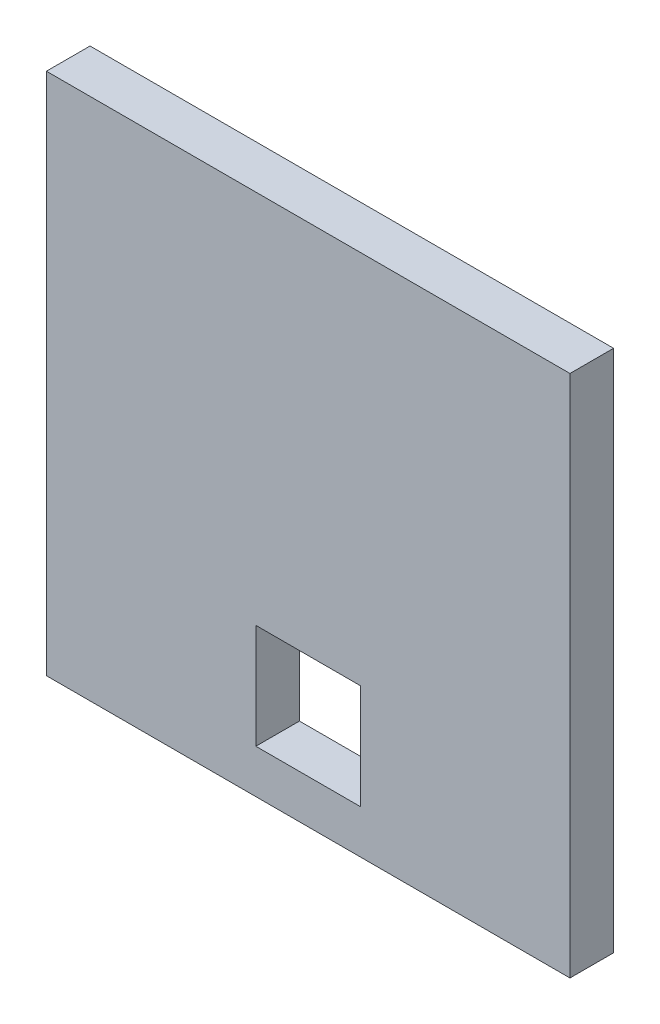
ISO-10303-21;
HEADER;
FILE_DESCRIPTION(('STEP AP214'),'2;1');
FILE_NAME('part.step','',(''),(''),'','','');
FILE_SCHEMA(('AUTOMOTIVE_DESIGN { 1 0 10303 214 1 1 1 1 }'));
ENDSEC;
DATA;
#1=APPLICATION_CONTEXT('core data for automotive mechanical design processes');
#2=APPLICATION_PROTOCOL_DEFINITION('international standard','automotive_design',2000,#1);
#3=PRODUCT_CONTEXT('',#1,'mechanical');
#4=PRODUCT('Part','Part','',(#3));
#5=PRODUCT_RELATED_PRODUCT_CATEGORY('part','',(#4));
#6=PRODUCT_DEFINITION_FORMATION('','',#4);
#7=PRODUCT_DEFINITION_CONTEXT('part definition',#1,'design');
#8=PRODUCT_DEFINITION('design','',#6,#7);
#9=PRODUCT_DEFINITION_SHAPE('','',#8);
#10=(LENGTH_UNIT() NAMED_UNIT(*) SI_UNIT(.MILLI.,.METRE.));
#11=(NAMED_UNIT(*) PLANE_ANGLE_UNIT() SI_UNIT($,.RADIAN.));
#12=(NAMED_UNIT(*) SI_UNIT($,.STERADIAN.) SOLID_ANGLE_UNIT());
#13=UNCERTAINTY_MEASURE_WITH_UNIT(LENGTH_MEASURE(1.E-05),#10,'distance_accuracy_value','');
#14=(GEOMETRIC_REPRESENTATION_CONTEXT(3) GLOBAL_UNCERTAINTY_ASSIGNED_CONTEXT((#13)) GLOBAL_UNIT_ASSIGNED_CONTEXT((#10,
#11,#12)) REPRESENTATION_CONTEXT('',''));
#15=CARTESIAN_POINT('',(0.,0.,0.));
#16=DIRECTION('',(0.,0.,1.));
#17=DIRECTION('',(1.,0.,0.));
#18=AXIS2_PLACEMENT_3D('',#15,#16,#17);
#19=CARTESIAN_POINT('',(0.,0.,3.175));
#20=DIRECTION('',(1.,0.,0.));
#21=DIRECTION('',(0.,0.,-1.));
#22=AXIS2_PLACEMENT_3D('',#19,#20,#21);
#23=PLANE('',#22);
#24=DIRECTION('',(0.,-1.,0.));
#25=VECTOR('',#24,1.);
#26=CARTESIAN_POINT('',(0.,0.,0.));
#27=LINE('',#26,#25);
#28=CARTESIAN_POINT('',(0.,38.1,0.));
#29=VERTEX_POINT('',#28);
#30=CARTESIAN_POINT('',(0.,0.,0.));
#31=VERTEX_POINT('',#30);
#32=EDGE_CURVE('E136',#29,#31,#27,.T.);
#33=ORIENTED_EDGE('',*,*,#32,.T.);
#34=DIRECTION('',(0.,0.,-1.));
#35=VECTOR('',#34,1.);
#36=CARTESIAN_POINT('',(0.,0.,3.175));
#37=LINE('',#36,#35);
#38=CARTESIAN_POINT('',(0.,0.,3.175));
#39=VERTEX_POINT('',#38);
#40=EDGE_CURVE('E11',#39,#31,#37,.T.);
#41=ORIENTED_EDGE('',*,*,#40,.F.);
#42=DIRECTION('',(0.,-1.,0.));
#43=VECTOR('',#42,1.);
#44=CARTESIAN_POINT('',(0.,0.,3.175));
#45=LINE('',#44,#43);
#46=CARTESIAN_POINT('',(0.,38.1,3.175));
#47=VERTEX_POINT('',#46);
#48=EDGE_CURVE('E140',#47,#39,#45,.T.);
#49=ORIENTED_EDGE('',*,*,#48,.F.);
#50=DIRECTION('',(0.,0.,-1.));
#51=VECTOR('',#50,1.);
#52=CARTESIAN_POINT('',(0.,38.1,3.175));
#53=LINE('',#52,#51);
#54=EDGE_CURVE('E150',#47,#29,#53,.T.);
#55=ORIENTED_EDGE('',*,*,#54,.T.);
#56=EDGE_LOOP('',(#33,#41,#49,#55));
#57=FACE_BOUND('',#56,.T.);
#58=ADVANCED_FACE('F39',(#57),#23,.F.);
#59=CARTESIAN_POINT('',(0.,0.,3.175));
#60=DIRECTION('',(0.,1.,0.));
#61=DIRECTION('',(0.,0.,1.));
#62=AXIS2_PLACEMENT_3D('',#59,#60,#61);
#63=PLANE('',#62);
#64=DIRECTION('',(1.,0.,0.));
#65=VECTOR('',#64,1.);
#66=CARTESIAN_POINT('',(0.,0.,0.));
#67=LINE('',#66,#65);
#68=CARTESIAN_POINT('',(38.1,0.,0.));
#69=VERTEX_POINT('',#68);
#70=EDGE_CURVE('E153',#31,#69,#67,.T.);
#71=ORIENTED_EDGE('',*,*,#70,.T.);
#72=DIRECTION('',(0.,0.,-1.));
#73=VECTOR('',#72,1.);
#74=CARTESIAN_POINT('',(38.1,0.,3.175));
#75=LINE('',#74,#73);
#76=CARTESIAN_POINT('',(38.1,0.,3.175));
#77=VERTEX_POINT('',#76);
#78=EDGE_CURVE('E46',#77,#69,#75,.T.);
#79=ORIENTED_EDGE('',*,*,#78,.F.);
#80=DIRECTION('',(1.,0.,0.));
#81=VECTOR('',#80,1.);
#82=CARTESIAN_POINT('',(0.,0.,3.175));
#83=LINE('',#82,#81);
#84=EDGE_CURVE('E143',#39,#77,#83,.T.);
#85=ORIENTED_EDGE('',*,*,#84,.F.);
#86=ORIENTED_EDGE('',*,*,#40,.T.);
#87=EDGE_LOOP('',(#71,#79,#85,#86));
#88=FACE_BOUND('',#87,.T.);
#89=ADVANCED_FACE('F181',(#88),#63,.F.);
#90=CARTESIAN_POINT('',(38.1,0.,3.175));
#91=DIRECTION('',(-1.,0.,0.));
#92=DIRECTION('',(0.,0.,1.));
#93=AXIS2_PLACEMENT_3D('',#90,#91,#92);
#94=PLANE('',#93);
#95=DIRECTION('',(0.,1.,0.));
#96=VECTOR('',#95,1.);
#97=CARTESIAN_POINT('',(38.1,0.,0.));
#98=LINE('',#97,#96);
#99=CARTESIAN_POINT('',(38.1,38.1,0.));
#100=VERTEX_POINT('',#99);
#101=EDGE_CURVE('E155',#69,#100,#98,.T.);
#102=ORIENTED_EDGE('',*,*,#101,.T.);
#103=DIRECTION('',(0.,0.,-1.));
#104=VECTOR('',#103,1.);
#105=CARTESIAN_POINT('',(38.1,38.1,3.175));
#106=LINE('',#105,#104);
#107=CARTESIAN_POINT('',(38.1,38.1,3.175));
#108=VERTEX_POINT('',#107);
#109=EDGE_CURVE('E160',#108,#100,#106,.T.);
#110=ORIENTED_EDGE('',*,*,#109,.F.);
#111=DIRECTION('',(0.,1.,0.));
#112=VECTOR('',#111,1.);
#113=CARTESIAN_POINT('',(38.1,0.,3.175));
#114=LINE('',#113,#112);
#115=EDGE_CURVE('E146',#77,#108,#114,.T.);
#116=ORIENTED_EDGE('',*,*,#115,.F.);
#117=ORIENTED_EDGE('',*,*,#78,.T.);
#118=EDGE_LOOP('',(#102,#110,#116,#117));
#119=FACE_BOUND('',#118,.T.);
#120=ADVANCED_FACE('F167',(#119),#94,.F.);
#121=CARTESIAN_POINT('',(0.,38.1,3.175));
#122=DIRECTION('',(0.,-1.,0.));
#123=DIRECTION('',(0.,0.,-1.));
#124=AXIS2_PLACEMENT_3D('',#121,#122,#123);
#125=PLANE('',#124);
#126=DIRECTION('',(-1.,0.,0.));
#127=VECTOR('',#126,1.);
#128=CARTESIAN_POINT('',(0.,38.1,0.));
#129=LINE('',#128,#127);
#130=EDGE_CURVE('E144',#100,#29,#129,.T.);
#131=ORIENTED_EDGE('',*,*,#130,.T.);
#132=ORIENTED_EDGE('',*,*,#54,.F.);
#133=DIRECTION('',(-1.,0.,0.));
#134=VECTOR('',#133,1.);
#135=CARTESIAN_POINT('',(0.,38.1,3.175));
#136=LINE('',#135,#134);
#137=EDGE_CURVE('E148',#108,#47,#136,.T.);
#138=ORIENTED_EDGE('',*,*,#137,.F.);
#139=ORIENTED_EDGE('',*,*,#109,.T.);
#140=EDGE_LOOP('',(#131,#132,#138,#139));
#141=FACE_BOUND('',#140,.T.);
#142=ADVANCED_FACE('F174',(#141),#125,.F.);
#143=CARTESIAN_POINT('',(0.,0.,3.175));
#144=DIRECTION('',(0.,0.,-1.));
#145=DIRECTION('',(-1.,0.,0.));
#146=AXIS2_PLACEMENT_3D('',#143,#144,#145);
#147=PLANE('',#146);
#148=DIRECTION('',(1.,0.,0.));
#149=VECTOR('',#148,1.);
#150=CARTESIAN_POINT('',(15.24,3.175,3.175));
#151=LINE('',#150,#149);
#152=CARTESIAN_POINT('',(15.24,3.175,3.175));
#153=VERTEX_POINT('',#152);
#154=CARTESIAN_POINT('',(22.86,3.175,3.175));
#155=VERTEX_POINT('',#154);
#156=EDGE_CURVE('E130',#153,#155,#151,.T.);
#157=ORIENTED_EDGE('',*,*,#156,.F.);
#158=DIRECTION('',(0.,-1.,0.));
#159=VECTOR('',#158,1.);
#160=CARTESIAN_POINT('',(15.24,10.795,3.175));
#161=LINE('',#160,#159);
#162=CARTESIAN_POINT('',(15.24,10.795,3.175));
#163=VERTEX_POINT('',#162);
#164=EDGE_CURVE('E53',#163,#153,#161,.T.);
#165=ORIENTED_EDGE('',*,*,#164,.F.);
#166=DIRECTION('',(-1.,0.,0.));
#167=VECTOR('',#166,1.);
#168=CARTESIAN_POINT('',(15.24,10.795,3.175));
#169=LINE('',#168,#167);
#170=CARTESIAN_POINT('',(22.86,10.795,3.175));
#171=VERTEX_POINT('',#170);
#172=EDGE_CURVE('E121',#171,#163,#169,.T.);
#173=ORIENTED_EDGE('',*,*,#172,.F.);
#174=DIRECTION('',(0.,1.,0.));
#175=VECTOR('',#174,1.);
#176=CARTESIAN_POINT('',(22.86,10.795,3.175));
#177=LINE('',#176,#175);
#178=EDGE_CURVE('E124',#155,#171,#177,.T.);
#179=ORIENTED_EDGE('',*,*,#178,.F.);
#180=EDGE_LOOP('',(#157,#165,#173,#179));
#181=FACE_BOUND('',#180,.T.);
#182=ORIENTED_EDGE('',*,*,#48,.T.);
#183=ORIENTED_EDGE('',*,*,#84,.T.);
#184=ORIENTED_EDGE('',*,*,#115,.T.);
#185=ORIENTED_EDGE('',*,*,#137,.T.);
#186=EDGE_LOOP('',(#182,#183,#184,#185));
#187=FACE_BOUND('',#186,.T.);
#188=ADVANCED_FACE('F180',(#181,#187),#147,.F.);
#189=CARTESIAN_POINT('',(0.,0.,0.));
#190=DIRECTION('',(0.,0.,-1.));
#191=DIRECTION('',(-1.,0.,0.));
#192=AXIS2_PLACEMENT_3D('',#189,#190,#191);
#193=PLANE('',#192);
#194=DIRECTION('',(0.,-1.,0.));
#195=VECTOR('',#194,1.);
#196=CARTESIAN_POINT('',(15.24,10.795,0.));
#197=LINE('',#196,#195);
#198=CARTESIAN_POINT('',(15.24,10.795,0.));
#199=VERTEX_POINT('',#198);
#200=CARTESIAN_POINT('',(15.24,3.175,0.));
#201=VERTEX_POINT('',#200);
#202=EDGE_CURVE('E105',#199,#201,#197,.T.);
#203=ORIENTED_EDGE('',*,*,#202,.T.);
#204=DIRECTION('',(1.,0.,0.));
#205=VECTOR('',#204,1.);
#206=CARTESIAN_POINT('',(15.24,3.175,0.));
#207=LINE('',#206,#205);
#208=CARTESIAN_POINT('',(22.86,3.175,0.));
#209=VERTEX_POINT('',#208);
#210=EDGE_CURVE('E114',#201,#209,#207,.T.);
#211=ORIENTED_EDGE('',*,*,#210,.T.);
#212=DIRECTION('',(0.,1.,0.));
#213=VECTOR('',#212,1.);
#214=CARTESIAN_POINT('',(22.86,10.795,0.));
#215=LINE('',#214,#213);
#216=CARTESIAN_POINT('',(22.86,10.795,0.));
#217=VERTEX_POINT('',#216);
#218=EDGE_CURVE('E61',#209,#217,#215,.T.);
#219=ORIENTED_EDGE('',*,*,#218,.T.);
#220=DIRECTION('',(-1.,0.,0.));
#221=VECTOR('',#220,1.);
#222=CARTESIAN_POINT('',(15.24,10.795,0.));
#223=LINE('',#222,#221);
#224=EDGE_CURVE('E111',#217,#199,#223,.T.);
#225=ORIENTED_EDGE('',*,*,#224,.T.);
#226=EDGE_LOOP('',(#203,#211,#219,#225));
#227=FACE_BOUND('',#226,.T.);
#228=ORIENTED_EDGE('',*,*,#32,.F.);
#229=ORIENTED_EDGE('',*,*,#130,.F.);
#230=ORIENTED_EDGE('',*,*,#101,.F.);
#231=ORIENTED_EDGE('',*,*,#70,.F.);
#232=EDGE_LOOP('',(#228,#229,#230,#231));
#233=FACE_BOUND('',#232,.T.);
#234=ADVANCED_FACE('F118',(#227,#233),#193,.T.);
#235=CARTESIAN_POINT('',(15.24,10.795,0.));
#236=DIRECTION('',(-1.,0.,0.));
#237=DIRECTION('',(0.,-1.,0.));
#238=AXIS2_PLACEMENT_3D('',#235,#236,#237);
#239=PLANE('',#238);
#240=ORIENTED_EDGE('',*,*,#164,.T.);
#241=DIRECTION('',(0.,0.,1.));
#242=VECTOR('',#241,1.);
#243=CARTESIAN_POINT('',(15.24,3.175,0.));
#244=LINE('',#243,#242);
#245=EDGE_CURVE('E101',#201,#153,#244,.T.);
#246=ORIENTED_EDGE('',*,*,#245,.F.);
#247=ORIENTED_EDGE('',*,*,#202,.F.);
#248=DIRECTION('',(0.,0.,1.));
#249=VECTOR('',#248,1.);
#250=CARTESIAN_POINT('',(15.24,10.795,0.));
#251=LINE('',#250,#249);
#252=EDGE_CURVE('E134',#199,#163,#251,.T.);
#253=ORIENTED_EDGE('',*,*,#252,.T.);
#254=EDGE_LOOP('',(#240,#246,#247,#253));
#255=FACE_BOUND('',#254,.T.);
#256=ADVANCED_FACE('F103',(#255),#239,.F.);
#257=CARTESIAN_POINT('',(15.24,10.795,0.));
#258=DIRECTION('',(0.,1.,0.));
#259=DIRECTION('',(0.,0.,1.));
#260=AXIS2_PLACEMENT_3D('',#257,#258,#259);
#261=PLANE('',#260);
#262=ORIENTED_EDGE('',*,*,#172,.T.);
#263=ORIENTED_EDGE('',*,*,#252,.F.);
#264=ORIENTED_EDGE('',*,*,#224,.F.);
#265=DIRECTION('',(0.,0.,1.));
#266=VECTOR('',#265,1.);
#267=CARTESIAN_POINT('',(22.86,10.795,0.));
#268=LINE('',#267,#266);
#269=EDGE_CURVE('E137',#217,#171,#268,.T.);
#270=ORIENTED_EDGE('',*,*,#269,.T.);
#271=EDGE_LOOP('',(#262,#263,#264,#270));
#272=FACE_BOUND('',#271,.T.);
#273=ADVANCED_FACE('F198',(#272),#261,.F.);
#274=CARTESIAN_POINT('',(22.86,10.795,0.));
#275=DIRECTION('',(1.,0.,0.));
#276=DIRECTION('',(0.,0.,-1.));
#277=AXIS2_PLACEMENT_3D('',#274,#275,#276);
#278=PLANE('',#277);
#279=ORIENTED_EDGE('',*,*,#178,.T.);
#280=ORIENTED_EDGE('',*,*,#269,.F.);
#281=ORIENTED_EDGE('',*,*,#218,.F.);
#282=DIRECTION('',(0.,0.,1.));
#283=VECTOR('',#282,1.);
#284=CARTESIAN_POINT('',(22.86,3.175,0.));
#285=LINE('',#284,#283);
#286=EDGE_CURVE('E110',#209,#155,#285,.T.);
#287=ORIENTED_EDGE('',*,*,#286,.T.);
#288=EDGE_LOOP('',(#279,#280,#281,#287));
#289=FACE_BOUND('',#288,.T.);
#290=ADVANCED_FACE('F201',(#289),#278,.F.);
#291=CARTESIAN_POINT('',(15.24,3.175,0.));
#292=DIRECTION('',(0.,-1.,0.));
#293=DIRECTION('',(0.,0.,-1.));
#294=AXIS2_PLACEMENT_3D('',#291,#292,#293);
#295=PLANE('',#294);
#296=ORIENTED_EDGE('',*,*,#156,.T.);
#297=ORIENTED_EDGE('',*,*,#286,.F.);
#298=ORIENTED_EDGE('',*,*,#210,.F.);
#299=ORIENTED_EDGE('',*,*,#245,.T.);
#300=EDGE_LOOP('',(#296,#297,#298,#299));
#301=FACE_BOUND('',#300,.T.);
#302=ADVANCED_FACE('F115',(#301),#295,.F.);
#303=CLOSED_SHELL('',(#58,#89,#120,#142,#188,#234,#256,#273,#290,#302));
#304=MANIFOLD_SOLID_BREP('B2',#303);
#305=ADVANCED_BREP_SHAPE_REPRESENTATION('',(#18,#304),#14);
#306=SHAPE_DEFINITION_REPRESENTATION(#9,#305);
ENDSEC;
END-ISO-10303-21;
